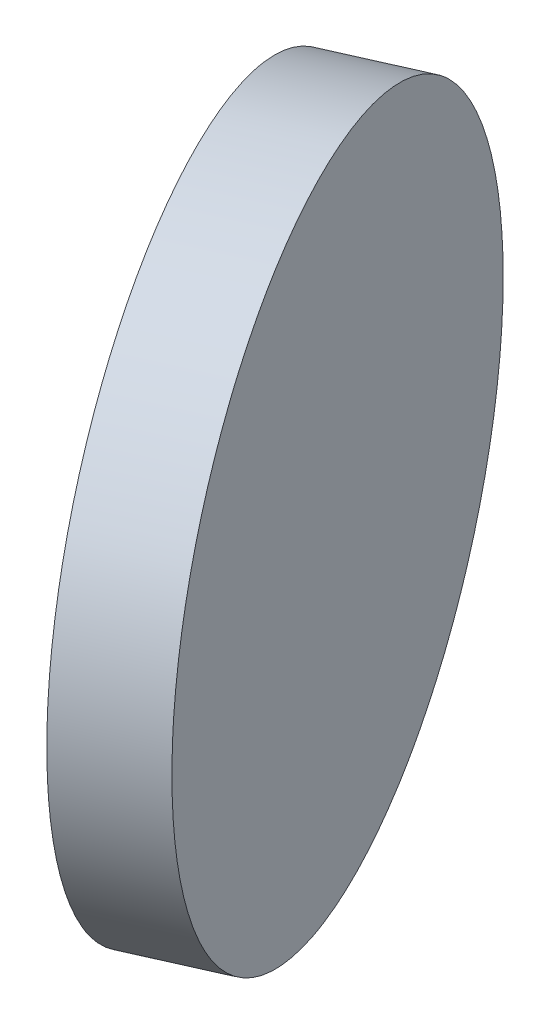
ISO-10303-21;
HEADER;
FILE_DESCRIPTION(('STEP AP214'),'2;1');
FILE_NAME('part.step','',(''),(''),'','','');
FILE_SCHEMA(('AUTOMOTIVE_DESIGN { 1 0 10303 214 1 1 1 1 }'));
ENDSEC;
DATA;
#1=APPLICATION_CONTEXT('core data for automotive mechanical design processes');
#2=APPLICATION_PROTOCOL_DEFINITION('international standard','automotive_design',2000,#1);
#3=PRODUCT_CONTEXT('',#1,'mechanical');
#4=PRODUCT('Part','Part','',(#3));
#5=PRODUCT_RELATED_PRODUCT_CATEGORY('part','',(#4));
#6=PRODUCT_DEFINITION_FORMATION('','',#4);
#7=PRODUCT_DEFINITION_CONTEXT('part definition',#1,'design');
#8=PRODUCT_DEFINITION('design','',#6,#7);
#9=PRODUCT_DEFINITION_SHAPE('','',#8);
#10=(LENGTH_UNIT() NAMED_UNIT(*) SI_UNIT(.MILLI.,.METRE.));
#11=(NAMED_UNIT(*) PLANE_ANGLE_UNIT() SI_UNIT($,.RADIAN.));
#12=(NAMED_UNIT(*) SI_UNIT($,.STERADIAN.) SOLID_ANGLE_UNIT());
#13=UNCERTAINTY_MEASURE_WITH_UNIT(LENGTH_MEASURE(1.E-05),#10,'distance_accuracy_value','');
#14=(GEOMETRIC_REPRESENTATION_CONTEXT(3) GLOBAL_UNCERTAINTY_ASSIGNED_CONTEXT((#13)) GLOBAL_UNIT_ASSIGNED_CONTEXT((#10,
#11,#12)) REPRESENTATION_CONTEXT('',''));
#15=CARTESIAN_POINT('',(0.,0.,0.));
#16=DIRECTION('',(0.,0.,1.));
#17=DIRECTION('',(1.,0.,0.));
#18=AXIS2_PLACEMENT_3D('',#15,#16,#17);
#19=CARTESIAN_POINT('',(143.670458160977,190.866099823164,114.046114975498));
#20=CARTESIAN_POINT('',(143.670458160977,191.240465528177,114.046114975498));
#21=CARTESIAN_POINT('',(143.700452388263,191.989196938203,114.113483112987));
#22=CARTESIAN_POINT('',(143.83369741905,193.069134060952,114.412756352074));
#23=CARTESIAN_POINT('',(144.050075607886,194.064409813418,114.898749721269));
#24=CARTESIAN_POINT('',(144.34127166232,194.936776306592,115.552786767944));
#25=CARTESIAN_POINT('',(144.696095081285,195.652708985369,116.349733215182));
#26=CARTESIAN_POINT('',(145.100910199778,196.184694958404,117.25896285795));
#27=CARTESIAN_POINT('',(145.540160199817,196.512290303094,118.245534510976));
#28=CARTESIAN_POINT('',(145.996964950237,196.622905714061,119.271534778912));
#29=CARTESIAN_POINT('',(146.453769700656,196.512290303094,120.297535046848));
#30=CARTESIAN_POINT('',(146.893019700695,196.184694958404,121.284106699874));
#31=CARTESIAN_POINT('',(147.297834819188,195.652708985369,122.193336342642));
#32=CARTESIAN_POINT('',(147.652658238153,194.936776306592,122.99028278988));
#33=CARTESIAN_POINT('',(147.943854292588,194.064409813418,123.644319836555));
#34=CARTESIAN_POINT('',(148.160232481423,193.069134060952,124.13031320575));
#35=CARTESIAN_POINT('',(148.29347751221,191.989196938203,124.429586444837));
#36=CARTESIAN_POINT('',(148.338468853139,190.866099823164,124.530638651071));
#37=CARTESIAN_POINT('',(148.29347751221,189.743002708125,124.429586444837));
#38=CARTESIAN_POINT('',(148.160232481423,188.663065585376,124.13031320575));
#39=CARTESIAN_POINT('',(147.943854292588,187.66778983291,123.644319836555));
#40=CARTESIAN_POINT('',(147.652658238154,186.795423339736,122.99028278988));
#41=CARTESIAN_POINT('',(147.297834819188,186.079490660959,122.193336342642));
#42=CARTESIAN_POINT('',(146.893019700696,185.547504687924,121.284106699874));
#43=CARTESIAN_POINT('',(146.453769700656,185.219909343234,120.297535046848));
#44=CARTESIAN_POINT('',(145.996964950237,185.109293932267,119.271534778912));
#45=CARTESIAN_POINT('',(145.540160199817,185.219909343234,118.245534510976));
#46=CARTESIAN_POINT('',(145.100910199778,185.547504687924,117.25896285795));
#47=CARTESIAN_POINT('',(144.696095081285,186.079490660959,116.349733215182));
#48=CARTESIAN_POINT('',(144.34127166232,186.795423339736,115.552786767944));
#49=CARTESIAN_POINT('',(144.050075607886,187.66778983291,114.898749721269));
#50=CARTESIAN_POINT('',(143.83369741905,188.663065585376,114.412756352074));
#51=CARTESIAN_POINT('',(143.700452388263,189.743002708125,114.113483112987));
#52=CARTESIAN_POINT('',(143.670458160977,190.491734118151,114.046114975498));
#53=CARTESIAN_POINT('',(143.670458160977,190.866099823164,114.046114975498));
#54=B_SPLINE_CURVE_WITH_KNOTS('',3,(#19,#20,#21,#22,#23,#24,#25,#26,#27,#28,#29,#30,#31,#32,#33,
#34,#35,#36,#37,#38,#39,#40,#41,#42,#43,#44,#45,#46,#47,#48,#49,#50,#51,#52,#53),.UNSPECIFIED.,
.T.,.F.,(4,1,1,1,1,1,1,1,1,1,1,1,1,1,1,1,1,1,1,1,1,1,1,1,1,1,1,1,1,1,1,1,4),(0.,
0.0312499999999998,0.0625000000000001,0.0937499999999999,0.125,0.15625,0.1875,0.21875,0.25,
0.28125,0.3125,0.34375,0.375,0.40625,0.4375,0.46875,0.5,0.53125,0.5625,0.59375,0.625,
0.656249999999999,0.6875,0.71875,0.75,0.78125,0.8125,0.84375,0.875,0.90625,0.9375,0.96875,1.),.UNSPECIFIED.);
#55=DIRECTION('',(0.913545457642608,0.,-0.406736643075785));
#56=VECTOR('',#55,1.);
#57=SURFACE_OF_LINEAR_EXTRUSION('',#54,#56);
#58=CARTESIAN_POINT('',(143.670458160977,190.866099823164,114.046114975498));
#59=CARTESIAN_POINT('',(143.670458162465,190.940973263994,114.046114978838));
#60=CARTESIAN_POINT('',(143.671058050188,191.015846377531,114.047462348725));
#61=CARTESIAN_POINT('',(143.673452976253,191.165477512427,114.052841440739));
#62=CARTESIAN_POINT('',(143.675248022438,191.240235533028,114.05687318048));
#63=CARTESIAN_POINT('',(143.680028651531,191.389521311145,114.067610649226));
#64=CARTESIAN_POINT('',(143.683014238464,191.46404906788,114.074316387269));
#65=CARTESIAN_POINT('',(143.690171349439,191.612759345707,114.090391521713));
#66=CARTESIAN_POINT('',(143.694342869472,191.686941867964,114.09976090911));
#67=CARTESIAN_POINT('',(143.703867256322,191.834846705146,114.121153032225));
#68=CARTESIAN_POINT('',(143.709220115387,191.908569023089,114.133175750531));
#69=CARTESIAN_POINT('',(143.721102557759,192.055438189221,114.15986415306));
#70=CARTESIAN_POINT('',(143.727632141064,192.128585037411,114.174529837284));
#71=CARTESIAN_POINT('',(143.741854345929,192.274192430149,114.206473432416));
#72=CARTESIAN_POINT('',(143.74954697512,192.34665297019,114.223751360466));
#73=CARTESIAN_POINT('',(143.766081627024,192.49077721933,114.260888796686));
#74=CARTESIAN_POINT('',(143.774923653623,192.562440925734,114.280748313583));
#75=CARTESIAN_POINT('',(143.793743460803,192.704860892097,114.323018292588));
#76=CARTESIAN_POINT('',(143.803721237545,192.775617155124,114.345428746072));
#77=CARTESIAN_POINT('',(143.824798921233,192.916111689556,114.392769998744));
#78=CARTESIAN_POINT('',(143.835898820814,192.985849967639,114.417700781391));
#79=CARTESIAN_POINT('',(143.859207069968,193.124197697504,114.470051966126));
#80=CARTESIAN_POINT('',(143.871415419541,193.192807149288,114.497472368214));
#81=CARTESIAN_POINT('',(143.896918351048,193.328795087881,114.554752890223));
#82=CARTESIAN_POINT('',(143.910212940112,193.396173566611,114.584613026152));
#83=CARTESIAN_POINT('',(143.937866197641,193.529597699914,114.646723259481));
#84=CARTESIAN_POINT('',(143.952224869703,193.595643349979,114.678973364958));
#85=CARTESIAN_POINT('',(143.981984138396,193.726299878153,114.745813776807));
#86=CARTESIAN_POINT('',(143.997384731504,193.790910761109,114.780404075267));
#87=CARTESIAN_POINT('',(144.029205708481,193.918595868576,114.851875159739));
#88=CARTESIAN_POINT('',(144.045626085658,193.981670103168,114.888755930719));
#89=CARTESIAN_POINT('',(144.079464418646,194.106179770571,114.964758070979));
#90=CARTESIAN_POINT('',(144.096882374459,194.167615203383,115.00387944026));
#91=CARTESIAN_POINT('',(144.132685969255,194.288757747756,115.084295630811));
#92=CARTESIAN_POINT('',(144.151071614589,194.348464847973,115.125590466342));
#93=CARTESIAN_POINT('',(144.188780778564,194.466061450782,115.210286635343));
#94=CARTESIAN_POINT('',(144.208104300376,194.52395094723,115.253687975934));
#95=CARTESIAN_POINT('',(144.247659398575,194.637822980118,115.342530181084));
#96=CARTESIAN_POINT('',(144.267890971892,194.693805523004,115.387971038749));
#97=CARTESIAN_POINT('',(144.309232379858,194.80377433643,115.480825361325));
#98=CARTESIAN_POINT('',(144.330342208743,194.857760620067,115.528238813292));
#99=CARTESIAN_POINT('',(144.373410237407,194.963647388317,115.624971189451));
#100=CARTESIAN_POINT('',(144.395368437186,195.015547872929,115.674290113643));
#101=CARTESIAN_POINT('',(144.440096783202,195.117189583037,115.774751623631));
#102=CARTESIAN_POINT('',(144.462866934766,195.166930794363,115.825894221391));
#103=CARTESIAN_POINT('',(144.509182863163,195.264180695183,115.929921499788));
#104=CARTESIAN_POINT('',(144.532728642617,195.31168937713,115.982806186314));
#105=CARTESIAN_POINT('',(144.580559490081,195.404400876369,116.090236028644));
#106=CARTESIAN_POINT('',(144.604844555591,195.449603701456,116.144781178836));
#107=CARTESIAN_POINT('',(144.654117667423,195.537630181012,116.255450399975));
#108=CARTESIAN_POINT('',(144.679105709131,195.580453851092,116.311574460559));
#109=CARTESIAN_POINT('',(144.729748353281,195.663648551065,116.425319701648));
#110=CARTESIAN_POINT('',(144.755402955723,195.704019580959,116.482940882153));
#111=CARTESIAN_POINT('',(144.807337167705,195.782254422886,116.599587032089));
#112=CARTESIAN_POINT('',(144.833616781345,195.820118218465,116.658612010728));
#113=CARTESIAN_POINT('',(144.88675957901,195.893284158144,116.777972688552));
#114=CARTESIAN_POINT('',(144.913622765008,195.928586293586,116.838308392167));
#115=CARTESIAN_POINT('',(144.967891249092,195.996574408254,116.960197403085));
#116=CARTESIAN_POINT('',(144.995296545347,196.029260396323,117.021750706271));
#117=CARTESIAN_POINT('',(145.050607822989,196.091961733766,117.145981869868));
#118=CARTESIAN_POINT('',(145.078513801091,196.121977100663,117.208659722896));
#119=CARTESIAN_POINT('',(145.134784892313,196.179282606697,117.33504666309));
#120=CARTESIAN_POINT('',(145.163150005434,196.206572745834,117.398755750255));
#121=CARTESIAN_POINT('',(145.220294280741,196.258394198478,117.527103894012));
#122=CARTESIAN_POINT('',(145.249073445642,196.28292549388,117.591742956702));
#123=CARTESIAN_POINT('',(145.307000864664,196.32919574639,117.721850070042));
#124=CARTESIAN_POINT('',(145.336149120031,196.350934694058,117.787318123493));
#125=CARTESIAN_POINT('',(145.394769733327,196.391586679037,117.918982176665));
#126=CARTESIAN_POINT('',(145.42424209016,196.410499725898,117.985178173925));
#127=CARTESIAN_POINT('',(145.483465952232,196.445466343994,118.118197146032));
#128=CARTESIAN_POINT('',(145.513217455639,196.46151993399,118.185020116762));
#129=CARTESIAN_POINT('',(145.572954527455,196.490734027624,118.319191776827));
#130=CARTESIAN_POINT('',(145.602940095865,196.503894531262,118.386540466161));
#131=CARTESIAN_POINT('',(145.663098412043,196.52731112526,118.521658256553));
#132=CARTESIAN_POINT('',(145.693271161038,196.537567196561,118.589427360366));
#133=CARTESIAN_POINT('',(145.753757083189,196.555163622046,118.725280965821));
#134=CARTESIAN_POINT('',(145.78407025682,196.562503966374,118.793365468529));
#135=CARTESIAN_POINT('',(145.844790242033,196.574257588677,118.929744788229));
#136=CARTESIAN_POINT('',(145.8751970533,196.578670876546,118.998039604511));
#137=CARTESIAN_POINT('',(145.936057559995,196.58455902777,119.134734540628));
#138=CARTESIAN_POINT('',(145.966511255116,196.586033910405,119.20313465977));
#139=CARTESIAN_POINT('',(146.027418645357,196.586033910405,119.339934898054));
#140=CARTESIAN_POINT('',(146.057872340478,196.58455902777,119.408335017196));
#141=CARTESIAN_POINT('',(146.118732847173,196.578670876546,119.545029953313));
#142=CARTESIAN_POINT('',(146.14913965844,196.574257588677,119.613324769595));
#143=CARTESIAN_POINT('',(146.209859643653,196.562503966374,119.749704089295));
#144=CARTESIAN_POINT('',(146.240172817284,196.555163622046,119.817788592002));
#145=CARTESIAN_POINT('',(146.300658739435,196.537567196561,119.953642197458));
#146=CARTESIAN_POINT('',(146.33083148843,196.52731112526,120.021411301271));
#147=CARTESIAN_POINT('',(146.390989804608,196.503894531262,120.156529091663));
#148=CARTESIAN_POINT('',(146.420975373018,196.490734027624,120.223877780997));
#149=CARTESIAN_POINT('',(146.480712444834,196.46151993399,120.358049441062));
#150=CARTESIAN_POINT('',(146.510463948241,196.445466343994,120.424872411792));
#151=CARTESIAN_POINT('',(146.569687810313,196.410499725898,120.557891383899));
#152=CARTESIAN_POINT('',(146.599160167146,196.391586679037,120.624087381159));
#153=CARTESIAN_POINT('',(146.657780780442,196.350934694059,120.755751434331));
#154=CARTESIAN_POINT('',(146.686929035809,196.32919574639,120.821219487782));
#155=CARTESIAN_POINT('',(146.744856454831,196.28292549388,120.951326601122));
#156=CARTESIAN_POINT('',(146.773635619732,196.258394198478,121.015965663812));
#157=CARTESIAN_POINT('',(146.830779895039,196.206572745834,121.144313807569));
#158=CARTESIAN_POINT('',(146.85914500816,196.179282606697,121.208022894734));
#159=CARTESIAN_POINT('',(146.915416099382,196.121977100663,121.334409834928));
#160=CARTESIAN_POINT('',(146.943322077484,196.091961733766,121.397087687956));
#161=CARTESIAN_POINT('',(146.998633355126,196.029260396323,121.521318851552));
#162=CARTESIAN_POINT('',(147.026038651381,195.996574408254,121.582872154739));
#163=CARTESIAN_POINT('',(147.080307135465,195.928586293586,121.704761165657));
#164=CARTESIAN_POINT('',(147.107170321463,195.893284158145,121.765096869272));
#165=CARTESIAN_POINT('',(147.160313119128,195.820118218465,121.884457547096));
#166=CARTESIAN_POINT('',(147.186592732768,195.782254422886,121.943482525735));
#167=CARTESIAN_POINT('',(147.23852694475,195.704019580959,122.060128675671));
#168=CARTESIAN_POINT('',(147.264181547192,195.663648551065,122.117749856176));
#169=CARTESIAN_POINT('',(147.314824191342,195.580453851092,122.231495097265));
#170=CARTESIAN_POINT('',(147.33981223305,195.537630181012,122.287619157849));
#171=CARTESIAN_POINT('',(147.389085344882,195.449603701456,122.398288378988));
#172=CARTESIAN_POINT('',(147.413370410392,195.404400876369,122.452833529179));
#173=CARTESIAN_POINT('',(147.461201257856,195.31168937713,122.56026337151));
#174=CARTESIAN_POINT('',(147.48474703731,195.264180695183,122.613148058036));
#175=CARTESIAN_POINT('',(147.531062965707,195.166930794363,122.717175336433));
#176=CARTESIAN_POINT('',(147.553833117271,195.117189583038,122.768317934193));
#177=CARTESIAN_POINT('',(147.598561463287,195.015547872929,122.868779444181));
#178=CARTESIAN_POINT('',(147.620519663066,194.963647388317,122.918098368373));
#179=CARTESIAN_POINT('',(147.66358769173,194.857760620068,123.014830744532));
#180=CARTESIAN_POINT('',(147.684697520615,194.80377433643,123.062244196499));
#181=CARTESIAN_POINT('',(147.726038928581,194.693805523004,123.155098519075));
#182=CARTESIAN_POINT('',(147.746270501899,194.637822980118,123.20053937674));
#183=CARTESIAN_POINT('',(147.785825600097,194.52395094723,123.28938158189));
#184=CARTESIAN_POINT('',(147.805149121909,194.466061450782,123.332782922481));
#185=CARTESIAN_POINT('',(147.842858285884,194.348464847973,123.417479091482));
#186=CARTESIAN_POINT('',(147.861243931218,194.288757747756,123.458773927013));
#187=CARTESIAN_POINT('',(147.897047526014,194.167615203384,123.539190117564));
#188=CARTESIAN_POINT('',(147.914465481827,194.106179770571,123.578311486844));
#189=CARTESIAN_POINT('',(147.948303814816,193.981670103168,123.654313627105));
#190=CARTESIAN_POINT('',(147.964724191992,193.918595868577,123.691194398085));
#191=CARTESIAN_POINT('',(147.996545168969,193.790910761109,123.762665482556));
#192=CARTESIAN_POINT('',(148.011945762077,193.726299878153,123.797255781017));
#193=CARTESIAN_POINT('',(148.04170503077,193.595643349979,123.864096192865));
#194=CARTESIAN_POINT('',(148.056063702832,193.529597699914,123.896346298343));
#195=CARTESIAN_POINT('',(148.083716960362,193.396173566612,123.958456531672));
#196=CARTESIAN_POINT('',(148.097011549425,193.328795087881,123.988316667601));
#197=CARTESIAN_POINT('',(148.122514480933,193.192807149288,124.04559718961));
#198=CARTESIAN_POINT('',(148.134722830505,193.124197697504,124.073017591698));
#199=CARTESIAN_POINT('',(148.158031079659,192.985849967639,124.125368776433));
#200=CARTESIAN_POINT('',(148.16913097924,192.916111689557,124.15029955908));
#201=CARTESIAN_POINT('',(148.190208662928,192.775617155122,124.197640811751));
#202=CARTESIAN_POINT('',(148.20018643967,192.704860892092,124.220051265236));
#203=CARTESIAN_POINT('',(148.219006246851,192.562440925739,124.262321244241));
#204=CARTESIAN_POINT('',(148.227848273449,192.490777219348,124.282180761138));
#205=CARTESIAN_POINT('',(148.244382925354,192.346652970171,124.319318197358));
#206=CARTESIAN_POINT('',(148.252075554544,192.274192430079,124.336596125409));
#207=CARTESIAN_POINT('',(148.266297759408,192.128585037481,124.368539720539));
#208=CARTESIAN_POINT('',(148.272827342713,192.055438189482,124.383205404759));
#209=CARTESIAN_POINT('',(148.284709785088,191.908569022828,124.409893807298));
#210=CARTESIAN_POINT('',(148.290062644159,191.834846704172,124.421916525617));
#211=CARTESIAN_POINT('',(148.299587030994,191.686941868938,124.443308648697));
#212=CARTESIAN_POINT('',(148.303758551006,191.612759349342,124.452678036047));
#213=CARTESIAN_POINT('',(148.310915662038,191.464049064245,124.468753170619));
#214=CARTESIAN_POINT('',(148.313901249049,191.389521297577,124.475458908838));
#215=CARTESIAN_POINT('',(148.318681877928,191.240235546595,124.486196377104));
#216=CARTESIAN_POINT('',(148.320476923821,191.16547756306,124.49022811619));
#217=CARTESIAN_POINT('',(148.322871850684,191.015846326898,124.495607209994));
#218=CARTESIAN_POINT('',(148.323471739496,190.940973075031,124.496954582326));
#219=CARTESIAN_POINT('',(148.323471739496,190.791226571297,124.496954582326));
#220=CARTESIAN_POINT('',(148.322871850684,190.71635331943,124.495607209994));
#221=CARTESIAN_POINT('',(148.320476923821,190.566722083268,124.49022811619));
#222=CARTESIAN_POINT('',(148.318681877928,190.491964099733,124.486196377104));
#223=CARTESIAN_POINT('',(148.313901249049,190.342678348751,124.475458908838));
#224=CARTESIAN_POINT('',(148.310915662038,190.268150582083,124.468753170619));
#225=CARTESIAN_POINT('',(148.303758551006,190.119440296986,124.452678036047));
#226=CARTESIAN_POINT('',(148.299587030994,190.04525777739,124.443308648697));
#227=CARTESIAN_POINT('',(148.290062644159,189.897352942156,124.421916525617));
#228=CARTESIAN_POINT('',(148.284709785088,189.8236306235,124.409893807298));
#229=CARTESIAN_POINT('',(148.272827342713,189.676761456846,124.383205404759));
#230=CARTESIAN_POINT('',(148.266297759408,189.603614608847,124.368539720539));
#231=CARTESIAN_POINT('',(148.252075554544,189.458007216249,124.336596125409));
#232=CARTESIAN_POINT('',(148.244382925354,189.385546676157,124.319318197358));
#233=CARTESIAN_POINT('',(148.227848273449,189.24142242698,124.282180761137));
#234=CARTESIAN_POINT('',(148.219006246851,189.169758720589,124.262321244241));
#235=CARTESIAN_POINT('',(148.20018643967,189.027338754236,124.220051265236));
#236=CARTESIAN_POINT('',(148.190208662928,188.956582491206,124.197640811751));
#237=CARTESIAN_POINT('',(148.16913097924,188.816087956771,124.15029955908));
#238=CARTESIAN_POINT('',(148.158031079659,188.746349678689,124.125368776433));
#239=CARTESIAN_POINT('',(148.134722830505,188.608001948824,124.073017591698));
#240=CARTESIAN_POINT('',(148.122514480933,188.539392497041,124.04559718961));
#241=CARTESIAN_POINT('',(148.097011549425,188.403404558447,123.988316667601));
#242=CARTESIAN_POINT('',(148.083716960362,188.336026079717,123.958456531672));
#243=CARTESIAN_POINT('',(148.056063702833,188.202601946414,123.896346298343));
#244=CARTESIAN_POINT('',(148.04170503077,188.136556296349,123.864096192865));
#245=CARTESIAN_POINT('',(148.011945762077,188.005899768175,123.797255781017));
#246=CARTESIAN_POINT('',(147.996545168969,187.941288885219,123.762665482556));
#247=CARTESIAN_POINT('',(147.964724191992,187.813603777752,123.691194398085));
#248=CARTESIAN_POINT('',(147.948303814816,187.75052954316,123.654313627105));
#249=CARTESIAN_POINT('',(147.914465481827,187.626019875757,123.578311486845));
#250=CARTESIAN_POINT('',(147.897047526014,187.564584442945,123.539190117564));
#251=CARTESIAN_POINT('',(147.861243931218,187.443441898572,123.458773927013));
#252=CARTESIAN_POINT('',(147.842858285885,187.383734798355,123.417479091482));
#253=CARTESIAN_POINT('',(147.805149121909,187.266138195546,123.332782922481));
#254=CARTESIAN_POINT('',(147.785825600097,187.208248699098,123.28938158189));
#255=CARTESIAN_POINT('',(147.746270501899,187.09437666621,123.20053937674));
#256=CARTESIAN_POINT('',(147.726038928581,187.038394123324,123.155098519075));
#257=CARTESIAN_POINT('',(147.684697520615,186.928425309898,123.062244196499));
#258=CARTESIAN_POINT('',(147.66358769173,186.87443902626,123.014830744532));
#259=CARTESIAN_POINT('',(147.620519663066,186.768552258011,122.918098368373));
#260=CARTESIAN_POINT('',(147.598561463288,186.716651773399,122.868779444181));
#261=CARTESIAN_POINT('',(147.553833117272,186.61501006329,122.768317934193));
#262=CARTESIAN_POINT('',(147.531062965707,186.565268851965,122.717175336433));
#263=CARTESIAN_POINT('',(147.48474703731,186.468018951145,122.613148058036));
#264=CARTESIAN_POINT('',(147.461201257856,186.420510269198,122.56026337151));
#265=CARTESIAN_POINT('',(147.413370410392,186.327798769959,122.45283352918));
#266=CARTESIAN_POINT('',(147.389085344882,186.282595944872,122.398288378988));
#267=CARTESIAN_POINT('',(147.33981223305,186.194569465316,122.287619157849));
#268=CARTESIAN_POINT('',(147.314824191342,186.151745795236,122.231495097265));
#269=CARTESIAN_POINT('',(147.264181547192,186.068551095263,122.117749856176));
#270=CARTESIAN_POINT('',(147.23852694475,186.028180065369,122.060128675671));
#271=CARTESIAN_POINT('',(147.186592732768,185.949945223442,121.943482525735));
#272=CARTESIAN_POINT('',(147.160313119128,185.912081427863,121.884457547096));
#273=CARTESIAN_POINT('',(147.107170321463,185.838915488184,121.765096869272));
#274=CARTESIAN_POINT('',(147.080307135465,185.803613352742,121.704761165657));
#275=CARTESIAN_POINT('',(147.026038651381,185.735625238074,121.582872154739));
#276=CARTESIAN_POINT('',(146.998633355127,185.702939250005,121.521318851553));
#277=CARTESIAN_POINT('',(146.943322077484,185.640237912562,121.397087687956));
#278=CARTESIAN_POINT('',(146.915416099382,185.610222545665,121.334409834928));
#279=CARTESIAN_POINT('',(146.85914500816,185.552917039631,121.208022894734));
#280=CARTESIAN_POINT('',(146.830779895039,185.525626900494,121.144313807569));
#281=CARTESIAN_POINT('',(146.773635619732,185.47380544785,121.015965663812));
#282=CARTESIAN_POINT('',(146.744856454831,185.449274152448,120.951326601122));
#283=CARTESIAN_POINT('',(146.686929035809,185.403003899938,120.821219487782));
#284=CARTESIAN_POINT('',(146.657780780442,185.381264952269,120.755751434331));
#285=CARTESIAN_POINT('',(146.599160167146,185.340612967291,120.624087381159));
#286=CARTESIAN_POINT('',(146.569687810313,185.32169992043,120.557891383899));
#287=CARTESIAN_POINT('',(146.510463948241,185.286733302335,120.424872411792));
#288=CARTESIAN_POINT('',(146.480712444834,185.270679712338,120.358049441062));
#289=CARTESIAN_POINT('',(146.420975373018,185.241465618704,120.223877780997));
#290=CARTESIAN_POINT('',(146.390989804608,185.228305115066,120.156529091663));
#291=CARTESIAN_POINT('',(146.33083148843,185.204888521068,120.021411301271));
#292=CARTESIAN_POINT('',(146.300658739435,185.194632449767,119.953642197458));
#293=CARTESIAN_POINT('',(146.240172817284,185.177036024282,119.817788592003));
#294=CARTESIAN_POINT('',(146.209859643653,185.169695679954,119.749704089295));
#295=CARTESIAN_POINT('',(146.14913965844,185.157942057651,119.613324769595));
#296=CARTESIAN_POINT('',(146.118732847174,185.153528769782,119.545029953313));
#297=CARTESIAN_POINT('',(146.057872340478,185.147640618558,119.408335017196));
#298=CARTESIAN_POINT('',(146.027418645357,185.146165735923,119.339934898054));
#299=CARTESIAN_POINT('',(145.966511255116,185.146165735923,119.20313465977));
#300=CARTESIAN_POINT('',(145.936057559995,185.147640618558,119.134734540628));
#301=CARTESIAN_POINT('',(145.8751970533,185.153528769782,118.998039604511));
#302=CARTESIAN_POINT('',(145.844790242033,185.157942057651,118.929744788229));
#303=CARTESIAN_POINT('',(145.78407025682,185.169695679954,118.793365468529));
#304=CARTESIAN_POINT('',(145.75375708319,185.177036024282,118.725280965821));
#305=CARTESIAN_POINT('',(145.693271161038,185.194632449767,118.589427360366));
#306=CARTESIAN_POINT('',(145.663098412043,185.204888521068,118.521658256553));
#307=CARTESIAN_POINT('',(145.602940095865,185.228305115066,118.386540466161));
#308=CARTESIAN_POINT('',(145.572954527456,185.241465618704,118.319191776827));
#309=CARTESIAN_POINT('',(145.513217455639,185.270679712338,118.185020116762));
#310=CARTESIAN_POINT('',(145.483465952233,185.286733302334,118.118197146032));
#311=CARTESIAN_POINT('',(145.42424209016,185.32169992043,117.985178173925));
#312=CARTESIAN_POINT('',(145.394769733328,185.340612967291,117.918982176665));
#313=CARTESIAN_POINT('',(145.336149120032,185.381264952269,117.787318123493));
#314=CARTESIAN_POINT('',(145.307000864664,185.403003899938,117.721850070042));
#315=CARTESIAN_POINT('',(145.249073445642,185.449274152448,117.591742956702));
#316=CARTESIAN_POINT('',(145.220294280741,185.47380544785,117.527103894012));
#317=CARTESIAN_POINT('',(145.163150005434,185.525626900494,117.398755750255));
#318=CARTESIAN_POINT('',(145.134784892313,185.552917039631,117.33504666309));
#319=CARTESIAN_POINT('',(145.078513801091,185.610222545665,117.208659722896));
#320=CARTESIAN_POINT('',(145.050607822989,185.640237912562,117.145981869868));
#321=CARTESIAN_POINT('',(144.995296545347,185.702939250005,117.021750706271));
#322=CARTESIAN_POINT('',(144.967891249093,185.735625238074,116.960197403085));
#323=CARTESIAN_POINT('',(144.913622765008,185.803613352742,116.838308392167));
#324=CARTESIAN_POINT('',(144.886759579011,185.838915488183,116.777972688552));
#325=CARTESIAN_POINT('',(144.833616781345,185.912081427863,116.658612010728));
#326=CARTESIAN_POINT('',(144.807337167705,185.949945223442,116.599587032089));
#327=CARTESIAN_POINT('',(144.755402955723,186.028180065369,116.482940882153));
#328=CARTESIAN_POINT('',(144.729748353281,186.068551095263,116.425319701648));
#329=CARTESIAN_POINT('',(144.679105709131,186.151745795236,116.311574460559));
#330=CARTESIAN_POINT('',(144.654117667423,186.194569465316,116.255450399975));
#331=CARTESIAN_POINT('',(144.604844555591,186.282595944872,116.144781178836));
#332=CARTESIAN_POINT('',(144.580559490081,186.327798769959,116.090236028644));
#333=CARTESIAN_POINT('',(144.532728642618,186.420510269198,115.982806186314));
#334=CARTESIAN_POINT('',(144.509182863163,186.468018951145,115.929921499788));
#335=CARTESIAN_POINT('',(144.462866934766,186.565268851965,115.825894221391));
#336=CARTESIAN_POINT('',(144.440096783202,186.61501006329,115.774751623631));
#337=CARTESIAN_POINT('',(144.395368437186,186.716651773399,115.674290113643));
#338=CARTESIAN_POINT('',(144.373410237407,186.768552258011,115.624971189451));
#339=CARTESIAN_POINT('',(144.330342208743,186.87443902626,115.528238813292));
#340=CARTESIAN_POINT('',(144.309232379858,186.928425309898,115.480825361325));
#341=CARTESIAN_POINT('',(144.267890971892,187.038394123324,115.387971038749));
#342=CARTESIAN_POINT('',(144.247659398575,187.09437666621,115.342530181084));
#343=CARTESIAN_POINT('',(144.208104300376,187.208248699098,115.253687975934));
#344=CARTESIAN_POINT('',(144.188780778564,187.266138195546,115.210286635343));
#345=CARTESIAN_POINT('',(144.151071614589,187.383734798355,115.125590466342));
#346=CARTESIAN_POINT('',(144.132685969255,187.443441898572,115.084295630811));
#347=CARTESIAN_POINT('',(144.096882374459,187.564584442944,115.00387944026));
#348=CARTESIAN_POINT('',(144.079464418647,187.626019875757,114.964758070979));
#349=CARTESIAN_POINT('',(144.045626085658,187.75052954316,114.888755930719));
#350=CARTESIAN_POINT('',(144.029205708481,187.813603777751,114.851875159739));
#351=CARTESIAN_POINT('',(143.997384731504,187.941288885219,114.780404075267));
#352=CARTESIAN_POINT('',(143.981984138396,188.005899768175,114.745813776807));
#353=CARTESIAN_POINT('',(143.952224869703,188.136556296348,114.678973364958));
#354=CARTESIAN_POINT('',(143.937866197641,188.202601946414,114.646723259481));
#355=CARTESIAN_POINT('',(143.910212940112,188.336026079716,114.584613026152));
#356=CARTESIAN_POINT('',(143.896918351049,188.403404558447,114.554752890223));
#357=CARTESIAN_POINT('',(143.871415419541,188.53939249704,114.497472368214));
#358=CARTESIAN_POINT('',(143.859207069968,188.608001948823,114.470051966126));
#359=CARTESIAN_POINT('',(143.835898820815,188.746349678689,114.417700781391));
#360=CARTESIAN_POINT('',(143.824798921233,188.816087956772,114.392769998744));
#361=CARTESIAN_POINT('',(143.803721237545,188.956582491204,114.345428746072));
#362=CARTESIAN_POINT('',(143.793743460803,189.027338754231,114.323018292588));
#363=CARTESIAN_POINT('',(143.774923653623,189.169758720594,114.280748313583));
#364=CARTESIAN_POINT('',(143.766081627024,189.241422426998,114.260888796686));
#365=CARTESIAN_POINT('',(143.74954697512,189.385546676138,114.223751360466));
#366=CARTESIAN_POINT('',(143.741854345929,189.458007216179,114.206473432416));
#367=CARTESIAN_POINT('',(143.727632141064,189.603614608917,114.174529837284));
#368=CARTESIAN_POINT('',(143.721102557759,189.676761457107,114.15986415306));
#369=CARTESIAN_POINT('',(143.709220115387,189.823630623239,114.133175750531));
#370=CARTESIAN_POINT('',(143.703867256322,189.897352941182,114.121153032225));
#371=CARTESIAN_POINT('',(143.694342869472,190.045257778364,114.09976090911));
#372=CARTESIAN_POINT('',(143.690171349439,190.119440300621,114.090391521713));
#373=CARTESIAN_POINT('',(143.683014238464,190.268150578448,114.074316387269));
#374=CARTESIAN_POINT('',(143.680028651531,190.342678335183,114.067610649226));
#375=CARTESIAN_POINT('',(143.675248022438,190.4919641133,114.05687318048));
#376=CARTESIAN_POINT('',(143.673452976254,190.566722133901,114.052841440739));
#377=CARTESIAN_POINT('',(143.671058050188,190.716353268797,114.047462348725));
#378=CARTESIAN_POINT('',(143.670458162465,190.791226382334,114.046114978838));
#379=CARTESIAN_POINT('',(143.670458160977,190.866099823164,114.046114975498));
#380=B_SPLINE_CURVE_WITH_KNOTS('',3,(#58,#59,#60,#61,#62,#63,#64,#65,#66,#67,#68,#69,#70,#71,
#72,#73,#74,#75,#76,#77,#78,#79,#80,#81,#82,#83,#84,#85,#86,#87,#88,#89,#90,#91,#92,#93,#94,#95,
#96,#97,#98,#99,#100,#101,#102,#103,#104,#105,#106,#107,#108,#109,#110,#111,#112,#113,#114,#115,
#116,#117,#118,#119,#120,#121,#122,#123,#124,#125,#126,#127,#128,#129,#130,#131,#132,#133,#134,
#135,#136,#137,#138,#139,#140,#141,#142,#143,#144,#145,#146,#147,#148,#149,#150,#151,#152,#153,
#154,#155,#156,#157,#158,#159,#160,#161,#162,#163,#164,#165,#166,#167,#168,#169,#170,#171,#172,
#173,#174,#175,#176,#177,#178,#179,#180,#181,#182,#183,#184,#185,#186,#187,#188,#189,#190,#191,
#192,#193,#194,#195,#196,#197,#198,#199,#200,#201,#202,#203,#204,#205,#206,#207,#208,#209,#210,
#211,#212,#213,#214,#215,#216,#217,#218,#219,#220,#221,#222,#223,#224,#225,#226,#227,#228,#229,
#230,#231,#232,#233,#234,#235,#236,#237,#238,#239,#240,#241,#242,#243,#244,#245,#246,#247,#248,
#249,#250,#251,#252,#253,#254,#255,#256,#257,#258,#259,#260,#261,#262,#263,#264,#265,#266,#267,
#268,#269,#270,#271,#272,#273,#274,#275,#276,#277,#278,#279,#280,#281,#282,#283,#284,#285,#286,
#287,#288,#289,#290,#291,#292,#293,#294,#295,#296,#297,#298,#299,#300,#301,#302,#303,#304,#305,
#306,#307,#308,#309,#310,#311,#312,#313,#314,#315,#316,#317,#318,#319,#320,#321,#322,#323,#324,
#325,#326,#327,#328,#329,#330,#331,#332,#333,#334,#335,#336,#337,#338,#339,#340,#341,#342,#343,
#344,#345,#346,#347,#348,#349,#350,#351,#352,#353,#354,#355,#356,#357,#358,#359,#360,#361,#362,
#363,#364,#365,#366,#367,#368,#369,#370,#371,#372,#373,#374,#375,#376,#377,#378,#379),
.UNSPECIFIED.,.F.,.F.,(4,2,2,2,2,2,2,2,2,2,2,2,2,2,2,2,2,2,2,2,2,2,2,2,2,2,2,2,2,2,2,2,2,2,2,2,
2,2,2,2,2,2,2,2,2,2,2,2,2,2,2,2,2,2,2,2,2,2,2,2,2,2,2,2,2,2,2,2,2,2,2,2,2,2,2,2,2,2,2,2,2,2,2,2,
2,2,2,2,2,2,2,2,2,2,2,2,2,2,2,2,2,2,2,2,2,2,2,2,2,2,2,2,2,2,2,2,2,2,2,2,2,2,2,2,2,2,2,2,2,2,2,2,
2,2,2,2,2,2,2,2,2,2,2,2,2,2,2,2,2,2,2,2,2,2,2,2,2,2,2,2,4),(0.,0.224605350375116,
0.449212174577052,0.67381975801935,0.898426582221215,1.1230319325963,1.34763728297138,
1.57224410717334,1.79685169061561,2.02145851481757,2.24606386519263,2.47066921556778,
2.6952760397697,2.91988362321194,3.14449044741391,3.369095797789,3.5937011481641,
3.81830797236604,4.04291555580834,4.26752238001019,4.49212773038531,4.71673308076039,
4.94133990496233,5.1659474884046,5.39055431260655,5.61515966298163,5.83976501335673,
6.06437183755866,6.28897942100095,6.51358624520287,6.73819159557798,6.96279694595309,
7.18740377015499,7.41201135359729,7.6366181777992,7.86122352817432,8.08582887854944,
8.31043570275136,8.53504328619367,8.7596501103956,8.98425546077071,9.20886081114579,
9.43346763534771,9.65807521878997,9.88268204299192,10.107287393367,10.3318927437421,
10.5564995679441,10.7811071513863,11.0057139755883,11.2303193259633,11.4549246763385,
11.6795315005404,11.9041390839826,12.1287459081846,12.3533512585597,12.5779566089348,
12.8025634331367,13.027171016579,13.2517778407809,13.476383191156,13.7009885415311,
13.9255953657331,14.1502029491754,14.3748097733773,14.5994151237524,14.8240204741274,
15.0486272983294,15.2732348817717,15.4978417059736,15.7224470563487,15.9470524067238,
16.1716592309257,16.396266814368,16.62087363857,16.8454789889451,17.0700843393202,
17.2946911635221,17.5192987469644,17.7439055711663,17.9685109215414,18.1931162719165,
18.4177230961184,18.6423306795607,18.8669375037626,19.0915428541377,19.3161482045128,
19.5407550287147,19.765362612157,19.989969436359,20.2145747867341,20.4391801371092,
20.6637869613111,20.8883945447534,21.1130013689553,21.3376067193304,21.5622120697055,
21.7868188939074,22.0114264773497,22.2360333015516,22.4606386519267,22.6852440023018,
22.9098508265037,23.1344584099461,23.3590652341479,23.5836705845231,23.8082759348981,
24.0328827591001,24.2574903425423,24.4820971667443,24.7067025171194,24.9313078674945,
25.1559146916964,25.3805222751387,25.6051290993406,25.8297344497158,26.0543398000909,
26.2789466242928,26.5035542077351,26.728161031937,26.9527663823121,27.1773717326872,
27.4019785568892,27.6265861403314,27.8511929645334,28.0757983149085,28.3004036652836,
28.5250104894855,28.7496180729278,28.9742248971297,29.1988302475048,29.4234355978799,
29.6480424220818,29.8726500055241,30.097256829726,30.3218621801011,30.5464675304762,
30.7710743546782,30.9956819381204,31.2202887623223,31.4448941126974,31.6694994630726,
31.8941062872745,32.1187138707168,32.3433206949187,32.5679260452938,32.7925313956689,
33.0171382198708,33.2417458033131,33.466352627515,33.6909579778901,33.9155633282652,
34.1401701524672,34.3647777359094,34.5893845601113,34.8139899104865,35.0385952608616,
35.2632020850635,35.4878096685058,35.7124164927077,35.9370218430828),.UNSPECIFIED.);
#381=CARTESIAN_POINT('',(143.670458160977,190.866099823164,114.046114975498));
#382=VERTEX_POINT('',#381);
#383=EDGE_CURVE('E9',#382,#382,#380,.T.);
#384=ORIENTED_EDGE('',*,*,#383,.T.);
#385=EDGE_LOOP('',(#384));
#386=FACE_BOUND('',#385,.T.);
#387=CARTESIAN_POINT('',(145.185392190606,190.866099823164,113.371622889157));
#388=CARTESIAN_POINT('',(145.185392215046,190.775343982674,113.37162294405));
#389=CARTESIAN_POINT('',(145.186273582598,190.684588746731,113.373602527983));
#390=CARTESIAN_POINT('',(145.189790839397,190.503283241522,113.381502416096));
#391=CARTESIAN_POINT('',(145.192426742048,190.412732973827,113.387422750383));
#392=CARTESIAN_POINT('',(145.199444906478,190.232042498649,113.403185805778));
#393=CARTESIAN_POINT('',(145.203827169358,190.141902291425,113.41302852936));
#394=CARTESIAN_POINT('',(145.214329620114,189.962236374775,113.436617419974));
#395=CARTESIAN_POINT('',(145.220449795226,189.872710660842,113.450363558337));
#396=CARTESIAN_POINT('',(145.234420880055,189.694479418526,113.481743128635));
#397=CARTESIAN_POINT('',(145.242271786793,189.605773888732,113.499376553877));
#398=CARTESIAN_POINT('',(145.259681447536,189.429381259657,113.538479292128));
#399=CARTESIAN_POINT('',(145.269240214649,189.3416941682,113.559948634577));
#400=CARTESIAN_POINT('',(145.290041006169,189.16753509519,113.606667977257));
#401=CARTESIAN_POINT('',(145.301283033734,189.081063115918,113.631917984581));
#402=CARTESIAN_POINT('',(145.325425798016,188.909530768034,113.686143520982));
#403=CARTESIAN_POINT('',(145.338326523415,188.824470389796,113.715119024639));
#404=CARTESIAN_POINT('',(145.365763830686,188.655959886054,113.776744225746));
#405=CARTESIAN_POINT('',(145.380300407094,188.572509755174,113.809393910925));
#406=CARTESIAN_POINT('',(145.410973058628,188.407405181131,113.878285814223));
#407=CARTESIAN_POINT('',(145.427109145615,188.32575075129,113.914528058983));
#408=CARTESIAN_POINT('',(145.460940660013,188.16441826212,113.990514884438));
#409=CARTESIAN_POINT('',(145.478636092222,188.084740208872,114.030259475909));
#410=CARTESIAN_POINT('',(145.515546698352,187.927541493328,114.113162054625));
#411=CARTESIAN_POINT('',(145.534761862995,187.850020817863,114.156320021029));
#412=CARTESIAN_POINT('',(145.574673904261,187.697320824306,114.245963933434));
#413=CARTESIAN_POINT('',(145.595370773814,187.622141495045,114.292449863555));
#414=CARTESIAN_POINT('',(145.638197731803,187.47429179822,114.388640786113));
#415=CARTESIAN_POINT('',(145.660327830043,187.401621447825,114.438345800571));
#416=CARTESIAN_POINT('',(145.705967129639,187.258947061285,114.540853345799));
#417=CARTESIAN_POINT('',(145.72947633679,187.188943036346,114.593655889584));
#418=CARTESIAN_POINT('',(145.777820767963,187.051760071178,114.702239259812));
#419=CARTESIAN_POINT('',(145.802655985061,186.9845811162,114.758020070702));
#420=CARTESIAN_POINT('',(145.853600458348,186.853210154384,114.872443231132));
#421=CARTESIAN_POINT('',(145.879709706952,186.789018129768,114.931085563636));
#422=CARTESIAN_POINT('',(145.933143090959,186.66376638726,115.051098909069));
#423=CARTESIAN_POINT('',(145.960467233592,186.602706688016,115.112469938239));
#424=CARTESIAN_POINT('',(146.016264572332,186.483847391722,115.237792812934));
#425=CARTESIAN_POINT('',(146.044737774437,186.426047811697,115.301744671934));
#426=CARTESIAN_POINT('',(146.102768675471,186.31383933387,115.432084209679));
#427=CARTESIAN_POINT('',(146.132326369842,186.259430421821,115.498471878188));
#428=CARTESIAN_POINT('',(146.192462259208,186.154136348326,115.633539297136));
#429=CARTESIAN_POINT('',(146.223040447221,186.103251162775,115.702219031891));
#430=CARTESIAN_POINT('',(146.285149129998,186.00512368411,115.841717417387));
#431=CARTESIAN_POINT('',(146.316679629305,185.957881408377,115.912536078331));
#432=CARTESIAN_POINT('',(146.380618107162,185.867133238133,116.056144250864));
#433=CARTESIAN_POINT('',(146.413026091067,185.823627366434,116.128933774483));
#434=CARTESIAN_POINT('',(146.47864592613,185.740449430603,116.276318337134));
#435=CARTESIAN_POINT('',(146.511857774815,185.700777354674,116.35091337061));
#436=CARTESIAN_POINT('',(146.57901185502,185.625365778028,116.501743904267));
#437=CARTESIAN_POINT('',(146.612954081121,185.589626248148,116.577979392278));
#438=CARTESIAN_POINT('',(146.681493477729,185.522169067349,116.73192139752));
#439=CARTESIAN_POINT('',(146.716090650422,185.490451429863,116.809627919662));
#440=CARTESIAN_POINT('',(146.785859141807,185.431094190485,116.966330516973));
#441=CARTESIAN_POINT('',(146.821030464415,185.40345461642,117.045326600936));
#442=CARTESIAN_POINT('',(146.891867341027,185.352313929059,117.204428830756));
#443=CARTESIAN_POINT('',(146.927532894104,185.328812807999,117.284534974529));
#444=CARTESIAN_POINT('',(146.999278240309,185.286009531955,117.445677660462));
#445=CARTESIAN_POINT('',(147.035358030256,185.266707344743,117.526714195476));
#446=CARTESIAN_POINT('',(147.107851205983,185.232358129311,117.689536534017));
#447=CARTESIAN_POINT('',(147.144264592338,185.217311108416,117.771322338832));
#448=CARTESIAN_POINT('',(147.217341309613,185.191489850668,117.935455333149));
#449=CARTESIAN_POINT('',(147.254004642367,185.180715645197,118.017802526769));
#450=CARTESIAN_POINT('',(147.327498059291,185.16346084153,118.18287144382));
#451=CARTESIAN_POINT('',(147.364328143356,185.156980240626,118.265593167015));
#452=CARTESIAN_POINT('',(147.438071811996,185.148332704299,118.431224158623));
#453=CARTESIAN_POINT('',(147.47498539593,185.146165735923,118.514133425597));
#454=CARTESIAN_POINT('',(147.5488125638,185.146165735923,118.679951959546));
#455=CARTESIAN_POINT('',(147.585726147735,185.148332704299,118.76286122652));
#456=CARTESIAN_POINT('',(147.659469816375,185.156980240626,118.928492218127));
#457=CARTESIAN_POINT('',(147.696299900439,185.16346084153,119.011213941322));
#458=CARTESIAN_POINT('',(147.769793317363,185.180715645197,119.176282858374));
#459=CARTESIAN_POINT('',(147.806456650118,185.191489850668,119.258630051994));
#460=CARTESIAN_POINT('',(147.879533367393,185.217311108416,119.42276304631));
#461=CARTESIAN_POINT('',(147.915946753748,185.232358129311,119.504548851126));
#462=CARTESIAN_POINT('',(147.988439929475,185.266707344743,119.667371189666));
#463=CARTESIAN_POINT('',(148.024519719422,185.286009531955,119.748407724681));
#464=CARTESIAN_POINT('',(148.096265065627,185.328812807999,119.909550410614));
#465=CARTESIAN_POINT('',(148.131930618704,185.352313929059,119.989656554387));
#466=CARTESIAN_POINT('',(148.202767495316,185.40345461642,120.148758784206));
#467=CARTESIAN_POINT('',(148.237938817924,185.431094190485,120.22775486817));
#468=CARTESIAN_POINT('',(148.307707309309,185.490451429863,120.384457465481));
#469=CARTESIAN_POINT('',(148.342304482002,185.522169067349,120.462163987623));
#470=CARTESIAN_POINT('',(148.410843878609,185.589626248148,120.616105992864));
#471=CARTESIAN_POINT('',(148.444786104711,185.625365778028,120.692341480876));
#472=CARTESIAN_POINT('',(148.511940184915,185.700777354674,120.843172014533));
#473=CARTESIAN_POINT('',(148.5451520336,185.740449430603,120.917767048009));
#474=CARTESIAN_POINT('',(148.610771868664,185.823627366434,121.065151610659));
#475=CARTESIAN_POINT('',(148.643179852569,185.867133238133,121.137941134278));
#476=CARTESIAN_POINT('',(148.707118330425,185.957881408378,121.281549306811));
#477=CARTESIAN_POINT('',(148.738648829733,186.00512368411,121.352367967755));
#478=CARTESIAN_POINT('',(148.80075751251,186.103251162775,121.491866353251));
#479=CARTESIAN_POINT('',(148.831335700522,186.154136348326,121.560546088006));
#480=CARTESIAN_POINT('',(148.891471589889,186.259430421821,121.695613506955));
#481=CARTESIAN_POINT('',(148.92102928426,186.31383933387,121.762001175464));
#482=CARTESIAN_POINT('',(148.979060185293,186.426047811697,121.892340713209));
#483=CARTESIAN_POINT('',(149.007533387399,186.483847391722,121.956292572209));
#484=CARTESIAN_POINT('',(149.063330726139,186.602706688016,122.081615446904));
#485=CARTESIAN_POINT('',(149.090654868772,186.66376638726,122.142986476073));
#486=CARTESIAN_POINT('',(149.144088252778,186.789018129768,122.262999821506));
#487=CARTESIAN_POINT('',(149.170197501383,186.853210154384,122.321642154011));
#488=CARTESIAN_POINT('',(149.22114197467,186.9845811162,122.436065314441));
#489=CARTESIAN_POINT('',(149.245977191768,187.051760071178,122.491846125331));
#490=CARTESIAN_POINT('',(149.294321622941,187.188943036346,122.600429495558));
#491=CARTESIAN_POINT('',(149.317830830091,187.258947061285,122.653232039344));
#492=CARTESIAN_POINT('',(149.363470129687,187.401621447825,122.755739584572));
#493=CARTESIAN_POINT('',(149.385600227928,187.47429179822,122.80544459903));
#494=CARTESIAN_POINT('',(149.428427185917,187.622141495045,122.901635521588));
#495=CARTESIAN_POINT('',(149.44912405547,187.697320824306,122.948121451709));
#496=CARTESIAN_POINT('',(149.489036096736,187.850020817863,123.037765364113));
#497=CARTESIAN_POINT('',(149.508251261378,187.927541493328,123.080923330517));
#498=CARTESIAN_POINT('',(149.545161867509,188.084740208872,123.163825909233));
#499=CARTESIAN_POINT('',(149.562857299718,188.16441826212,123.203570500705));
#500=CARTESIAN_POINT('',(149.596688814116,188.32575075129,123.27955732616));
#501=CARTESIAN_POINT('',(149.612824901103,188.407405181129,123.315799570919));
#502=CARTESIAN_POINT('',(149.643497552637,188.572509755176,123.384691474218));
#503=CARTESIAN_POINT('',(149.658034129045,188.655959886063,123.417341159398));
#504=CARTESIAN_POINT('',(149.685471436315,188.824470389786,123.478966360502));
#505=CARTESIAN_POINT('',(149.698372161712,188.909530768,123.507941864155));
#506=CARTESIAN_POINT('',(149.722514925999,189.081063115952,123.562167400567));
#507=CARTESIAN_POINT('',(149.733756953571,189.167535095319,123.587417407906));
#508=CARTESIAN_POINT('',(149.754557745072,189.341694168071,123.634136750545));
#509=CARTESIAN_POINT('',(149.764116512161,189.429381259176,123.655606092939));
#510=CARTESIAN_POINT('',(149.781526172972,189.605773889214,123.694708831341));
#511=CARTESIAN_POINT('',(149.789377079802,189.694479420325,123.712342256791));
#512=CARTESIAN_POINT('',(149.803348164379,189.872710659043,123.743721826522));
#513=CARTESIAN_POINT('',(149.809468339146,189.96223636806,123.757467964112));
#514=CARTESIAN_POINT('',(149.819970790843,190.141902298139,123.781056856838));
#515=CARTESIAN_POINT('',(149.824353055008,190.232042523709,123.790899583306));
#516=CARTESIAN_POINT('',(149.831371215928,190.412732948767,123.806662630819));
#517=CARTESIAN_POINT('',(149.834007113785,190.503283147997,123.812582954337));
#518=CARTESIAN_POINT('',(149.837524383681,190.684588840255,123.820482871868));
#519=CARTESIAN_POINT('',(149.838405769124,190.77534433171,123.822462495986));
#520=CARTESIAN_POINT('',(149.838405769124,190.956855314619,123.822462495986));
#521=CARTESIAN_POINT('',(149.837524383681,191.047610806073,123.820482871868));
#522=CARTESIAN_POINT('',(149.834007113785,191.228916498331,123.812582954337));
#523=CARTESIAN_POINT('',(149.831371215928,191.319466697561,123.806662630819));
#524=CARTESIAN_POINT('',(149.824353055008,191.500157122619,123.790899583306));
#525=CARTESIAN_POINT('',(149.819970790843,191.590297348189,123.781056856838));
#526=CARTESIAN_POINT('',(149.809468339146,191.769963278268,123.757467964112));
#527=CARTESIAN_POINT('',(149.803348164379,191.859488987286,123.743721826522));
#528=CARTESIAN_POINT('',(149.789377079802,192.037720226003,123.712342256791));
#529=CARTESIAN_POINT('',(149.781526172971,192.126425757114,123.694708831341));
#530=CARTESIAN_POINT('',(149.764116512161,192.302818387153,123.655606092939));
#531=CARTESIAN_POINT('',(149.754557745072,192.390505478258,123.634136750545));
#532=CARTESIAN_POINT('',(149.73375695357,192.564664551009,123.587417407906));
#533=CARTESIAN_POINT('',(149.722514925999,192.651136530376,123.562167400567));
#534=CARTESIAN_POINT('',(149.698372161712,192.822668878328,123.507941864155));
#535=CARTESIAN_POINT('',(149.685471436315,192.907729256542,123.478966360502));
#536=CARTESIAN_POINT('',(149.658034129045,193.076239760265,123.417341159398));
#537=CARTESIAN_POINT('',(149.643497552637,193.159689891152,123.384691474218));
#538=CARTESIAN_POINT('',(149.612824901103,193.324794465199,123.315799570919));
#539=CARTESIAN_POINT('',(149.596688814116,193.406448895039,123.27955732616));
#540=CARTESIAN_POINT('',(149.562857299718,193.567781384208,123.203570500705));
#541=CARTESIAN_POINT('',(149.545161867509,193.647459437456,123.163825909233));
#542=CARTESIAN_POINT('',(149.508251261378,193.804658153,123.080923330517));
#543=CARTESIAN_POINT('',(149.489036096736,193.882178828465,123.037765364113));
#544=CARTESIAN_POINT('',(149.44912405547,194.034878822022,122.948121451709));
#545=CARTESIAN_POINT('',(149.428427185917,194.110058151283,122.901635521588));
#546=CARTESIAN_POINT('',(149.385600227927,194.257907848108,122.80544459903));
#547=CARTESIAN_POINT('',(149.363470129687,194.330578198503,122.755739584572));
#548=CARTESIAN_POINT('',(149.317830830091,194.473252585043,122.653232039343));
#549=CARTESIAN_POINT('',(149.294321622941,194.543256609982,122.600429495558));
#550=CARTESIAN_POINT('',(149.245977191768,194.68043957515,122.491846125331));
#551=CARTESIAN_POINT('',(149.22114197467,194.747618530128,122.436065314441));
#552=CARTESIAN_POINT('',(149.170197501383,194.878989491944,122.321642154011));
#553=CARTESIAN_POINT('',(149.144088252778,194.94318151656,122.262999821506));
#554=CARTESIAN_POINT('',(149.090654868772,195.068433259068,122.142986476073));
#555=CARTESIAN_POINT('',(149.063330726139,195.129492958313,122.081615446904));
#556=CARTESIAN_POINT('',(149.007533387399,195.248352254606,121.956292572209));
#557=CARTESIAN_POINT('',(148.979060185293,195.306151834631,121.892340713209));
#558=CARTESIAN_POINT('',(148.921029284259,195.418360312458,121.762001175464));
#559=CARTESIAN_POINT('',(148.891471589889,195.472769224507,121.695613506955));
#560=CARTESIAN_POINT('',(148.831335700522,195.578063298002,121.560546088006));
#561=CARTESIAN_POINT('',(148.80075751251,195.628948483553,121.491866353251));
#562=CARTESIAN_POINT('',(148.738648829733,195.727075962218,121.352367967755));
#563=CARTESIAN_POINT('',(148.707118330425,195.774318237951,121.281549306811));
#564=CARTESIAN_POINT('',(148.643179852569,195.865066408195,121.137941134278));
#565=CARTESIAN_POINT('',(148.610771868664,195.908572279894,121.065151610659));
#566=CARTESIAN_POINT('',(148.5451520336,195.991750215725,120.917767048009));
#567=CARTESIAN_POINT('',(148.511940184915,196.031422291654,120.843172014533));
#568=CARTESIAN_POINT('',(148.44478610471,196.1068338683,120.692341480876));
#569=CARTESIAN_POINT('',(148.410843878609,196.14257339818,120.616105992864));
#570=CARTESIAN_POINT('',(148.342304482002,196.210030578979,120.462163987623));
#571=CARTESIAN_POINT('',(148.307707309309,196.241748216465,120.384457465481));
#572=CARTESIAN_POINT('',(148.237938817924,196.301105455843,120.22775486817));
#573=CARTESIAN_POINT('',(148.202767495316,196.328745029908,120.148758784206));
#574=CARTESIAN_POINT('',(148.131930618704,196.379885717269,119.989656554387));
#575=CARTESIAN_POINT('',(148.096265065627,196.403386838329,119.909550410614));
#576=CARTESIAN_POINT('',(148.024519719421,196.446190114373,119.748407724681));
#577=CARTESIAN_POINT('',(147.988439929475,196.465492301585,119.667371189666));
#578=CARTESIAN_POINT('',(147.915946753748,196.499841517017,119.504548851126));
#579=CARTESIAN_POINT('',(147.879533367393,196.514888537912,119.42276304631));
#580=CARTESIAN_POINT('',(147.806456650118,196.54070979566,119.258630051994));
#581=CARTESIAN_POINT('',(147.769793317363,196.551484001131,119.176282858374));
#582=CARTESIAN_POINT('',(147.696299900439,196.568738804798,119.011213941322));
#583=CARTESIAN_POINT('',(147.659469816375,196.575219405702,118.928492218127));
#584=CARTESIAN_POINT('',(147.585726147735,196.583866942029,118.76286122652));
#585=CARTESIAN_POINT('',(147.5488125638,196.586033910405,118.679951959546));
#586=CARTESIAN_POINT('',(147.47498539593,196.586033910405,118.514133425597));
#587=CARTESIAN_POINT('',(147.438071811995,196.583866942029,118.431224158623));
#588=CARTESIAN_POINT('',(147.364328143356,196.575219405702,118.265593167015));
#589=CARTESIAN_POINT('',(147.327498059291,196.568738804798,118.18287144382));
#590=CARTESIAN_POINT('',(147.254004642367,196.551484001131,118.017802526769));
#591=CARTESIAN_POINT('',(147.217341309613,196.54070979566,117.935455333149));
#592=CARTESIAN_POINT('',(147.144264592337,196.514888537912,117.771322338832));
#593=CARTESIAN_POINT('',(147.107851205983,196.499841517017,117.689536534017));
#594=CARTESIAN_POINT('',(147.035358030255,196.465492301585,117.526714195476));
#595=CARTESIAN_POINT('',(146.999278240309,196.446190114373,117.445677660462));
#596=CARTESIAN_POINT('',(146.927532894104,196.403386838329,117.284534974529));
#597=CARTESIAN_POINT('',(146.891867341027,196.379885717269,117.204428830756));
#598=CARTESIAN_POINT('',(146.821030464414,196.328745029908,117.045326600936));
#599=CARTESIAN_POINT('',(146.785859141807,196.301105455843,116.966330516973));
#600=CARTESIAN_POINT('',(146.716090650422,196.241748216465,116.809627919662));
#601=CARTESIAN_POINT('',(146.681493477728,196.210030578979,116.73192139752));
#602=CARTESIAN_POINT('',(146.612954081121,196.14257339818,116.577979392278));
#603=CARTESIAN_POINT('',(146.57901185502,196.1068338683,116.501743904267));
#604=CARTESIAN_POINT('',(146.511857774815,196.031422291654,116.35091337061));
#605=CARTESIAN_POINT('',(146.47864592613,195.991750215725,116.276318337134));
#606=CARTESIAN_POINT('',(146.413026091067,195.908572279894,116.128933774483));
#607=CARTESIAN_POINT('',(146.380618107162,195.865066408195,116.056144250864));
#608=CARTESIAN_POINT('',(146.316679629305,195.77431823795,115.912536078331));
#609=CARTESIAN_POINT('',(146.285149129998,195.727075962218,115.841717417387));
#610=CARTESIAN_POINT('',(146.223040447221,195.628948483553,115.702219031891));
#611=CARTESIAN_POINT('',(146.192462259208,195.578063298002,115.633539297136));
#612=CARTESIAN_POINT('',(146.132326369842,195.472769224507,115.498471878188));
#613=CARTESIAN_POINT('',(146.102768675471,195.418360312458,115.432084209679));
#614=CARTESIAN_POINT('',(146.044737774437,195.306151834631,115.301744671934));
#615=CARTESIAN_POINT('',(146.016264572331,195.248352254606,115.237792812934));
#616=CARTESIAN_POINT('',(145.960467233592,195.129492958312,115.112469938239));
#617=CARTESIAN_POINT('',(145.933143090959,195.068433259068,115.051098909069));
#618=CARTESIAN_POINT('',(145.879709706952,194.94318151656,114.931085563636));
#619=CARTESIAN_POINT('',(145.853600458348,194.878989491944,114.872443231132));
#620=CARTESIAN_POINT('',(145.802655985061,194.747618530128,114.758020070702));
#621=CARTESIAN_POINT('',(145.777820767963,194.68043957515,114.702239259812));
#622=CARTESIAN_POINT('',(145.72947633679,194.543256609982,114.593655889584));
#623=CARTESIAN_POINT('',(145.705967129639,194.473252585043,114.540853345799));
#624=CARTESIAN_POINT('',(145.660327830043,194.330578198503,114.438345800571));
#625=CARTESIAN_POINT('',(145.638197731803,194.257907848108,114.388640786113));
#626=CARTESIAN_POINT('',(145.595370773814,194.110058151283,114.292449863555));
#627=CARTESIAN_POINT('',(145.574673904261,194.034878822022,114.245963933434));
#628=CARTESIAN_POINT('',(145.534761862995,193.882178828465,114.156320021029));
#629=CARTESIAN_POINT('',(145.515546698352,193.804658153,114.113162054625));
#630=CARTESIAN_POINT('',(145.478636092222,193.647459437456,114.030259475909));
#631=CARTESIAN_POINT('',(145.460940660013,193.567781384208,113.990514884438));
#632=CARTESIAN_POINT('',(145.427109145615,193.406448895038,113.914528058983));
#633=CARTESIAN_POINT('',(145.410973058628,193.324794465197,113.878285814223));
#634=CARTESIAN_POINT('',(145.380300407094,193.159689891154,113.809393910925));
#635=CARTESIAN_POINT('',(145.365763830686,193.076239760274,113.776744225746));
#636=CARTESIAN_POINT('',(145.338326523415,192.907729256532,113.715119024639));
#637=CARTESIAN_POINT('',(145.325425798016,192.822668878294,113.686143520982));
#638=CARTESIAN_POINT('',(145.301283033734,192.65113653041,113.631917984581));
#639=CARTESIAN_POINT('',(145.290041006169,192.564664551138,113.606667977257));
#640=CARTESIAN_POINT('',(145.269240214649,192.390505478128,113.559948634577));
#641=CARTESIAN_POINT('',(145.259681447536,192.30281838667,113.538479292128));
#642=CARTESIAN_POINT('',(145.242271786793,192.126425757596,113.499376553877));
#643=CARTESIAN_POINT('',(145.234420880054,192.037720227802,113.481743128635));
#644=CARTESIAN_POINT('',(145.220449795226,191.859488985486,113.450363558337));
#645=CARTESIAN_POINT('',(145.214329620114,191.769963271553,113.436617419974));
#646=CARTESIAN_POINT('',(145.203827169358,191.590297354903,113.41302852936));
#647=CARTESIAN_POINT('',(145.199444906478,191.500157147679,113.403185805778));
#648=CARTESIAN_POINT('',(145.192426742048,191.319466672501,113.387422750383));
#649=CARTESIAN_POINT('',(145.189790839397,191.228916404806,113.381502416096));
#650=CARTESIAN_POINT('',(145.186273582598,191.047610899597,113.373602527983));
#651=CARTESIAN_POINT('',(145.185392215046,190.956855663654,113.37162294405));
#652=CARTESIAN_POINT('',(145.185392190606,190.866099823164,113.371622889157));
#653=B_SPLINE_CURVE_WITH_KNOTS('',3,(#387,#388,#389,#390,#391,#392,#393,#394,#395,#396,#397,
#398,#399,#400,#401,#402,#403,#404,#405,#406,#407,#408,#409,#410,#411,#412,#413,#414,#415,#416,
#417,#418,#419,#420,#421,#422,#423,#424,#425,#426,#427,#428,#429,#430,#431,#432,#433,#434,#435,
#436,#437,#438,#439,#440,#441,#442,#443,#444,#445,#446,#447,#448,#449,#450,#451,#452,#453,#454,
#455,#456,#457,#458,#459,#460,#461,#462,#463,#464,#465,#466,#467,#468,#469,#470,#471,#472,#473,
#474,#475,#476,#477,#478,#479,#480,#481,#482,#483,#484,#485,#486,#487,#488,#489,#490,#491,#492,
#493,#494,#495,#496,#497,#498,#499,#500,#501,#502,#503,#504,#505,#506,#507,#508,#509,#510,#511,
#512,#513,#514,#515,#516,#517,#518,#519,#520,#521,#522,#523,#524,#525,#526,#527,#528,#529,#530,
#531,#532,#533,#534,#535,#536,#537,#538,#539,#540,#541,#542,#543,#544,#545,#546,#547,#548,#549,
#550,#551,#552,#553,#554,#555,#556,#557,#558,#559,#560,#561,#562,#563,#564,#565,#566,#567,#568,
#569,#570,#571,#572,#573,#574,#575,#576,#577,#578,#579,#580,#581,#582,#583,#584,#585,#586,#587,
#588,#589,#590,#591,#592,#593,#594,#595,#596,#597,#598,#599,#600,#601,#602,#603,#604,#605,#606,
#607,#608,#609,#610,#611,#612,#613,#614,#615,#616,#617,#618,#619,#620,#621,#622,#623,#624,#625,
#626,#627,#628,#629,#630,#631,#632,#633,#634,#635,#636,#637,#638,#639,#640,#641,#642,#643,#644,
#645,#646,#647,#648,#649,#650,#651,#652),.UNSPECIFIED.,.F.,.F.,(4,2,2,2,2,2,2,2,2,2,2,2,2,2,2,2,
2,2,2,2,2,2,2,2,2,2,2,2,2,2,2,2,2,2,2,2,2,2,2,2,2,2,2,2,2,2,2,2,2,2,2,2,2,2,2,2,2,2,2,2,2,2,2,2,
2,2,2,2,2,2,2,2,2,2,2,2,2,2,2,2,2,2,2,2,2,2,2,2,2,2,2,2,2,2,2,2,2,2,2,2,2,2,2,2,2,2,2,2,2,2,2,2,
2,2,2,2,2,2,2,2,2,2,2,2,2,2,2,2,2,2,2,2,4),(0.,0.272240869082034,0.544483817952321,
0.816726938463777,1.08896805953156,1.36120871196949,1.63345145399144,1.90569470682855,
2.17793610219305,2.45017658832669,2.72241909342876,2.99466243619478,3.26690411686861,
3.53914449859534,3.81138674286835,4.08363013111242,4.35587209783711,4.62811244399065,
4.90035441071531,5.17259779895934,5.44484004323238,5.71708042495912,5.98932210563293,
6.26156544839895,6.533807953501,6.80604843963471,7.07828983499916,7.35053308783625,
7.62277582985827,7.89501648229619,8.16725760336393,8.43950072387536,8.71174367274563,
8.98398454182765,9.2562254109097,9.52846835977997,9.80071148029143,10.0729526013592,
10.3451932537971,10.6174359958191,10.8896792486563,11.1619206440207,11.4341611301544,
11.7064036352565,11.9786469780225,12.2508886586963,12.523129040423,12.795371284696,
13.0676146729401,13.3398566396647,13.6120969858183,13.884338952543,14.156582340787,
14.4288245850601,14.7010649667868,14.9733066474606,15.2455499902266,15.5177924953286,
15.7900329814623,16.0622743768268,16.3345176296639,16.606760371686,16.8790010241239,
17.1512421451916,17.423485265703,17.6957282145733,17.9679690836553,18.2402099527374,
18.5124529016077,18.7846960221191,19.0569371431869,19.3291777956248,19.6014205376468,
19.8736637904839,20.1459051858483,20.418145671982,20.6903881770841,20.9626315198501,
21.2348732005239,21.5071135822506,21.7793558265237,22.0515992147677,22.3238411814924,
22.596081527646,22.8683234943706,23.1405668826147,23.4128091268877,23.6850495086144,
23.9572911892882,24.2295345320543,24.5017770371563,24.77401752329,25.0462589186545,
25.3185021714916,25.5907449135136,25.8629855659515,26.1352266870192,26.4074698075307,
26.679712756401,26.951953625483,27.224194494565,27.4964374434353,27.7686805639468,
28.0409216850145,28.3131623374525,28.5854050794744,28.8576483323116,29.129889727676,
29.4021302138097,29.6743727189118,29.9466160616778,30.2188577423516,30.4910981240783,
30.7633403683513,31.0355837565954,31.3078257233201,31.5800660694736,31.8523080361983,
32.1245514244424,32.3967936687154,32.6690340504421,32.9412757311159,33.2135190738819,
33.485761578984,33.7580020651177,34.0302434604821,34.3024867133192,34.5747294553413,
34.8469701077792,35.1192112288469,35.3914543493584,35.6636972982286,35.9359381673107),.UNSPECIFIED.);
#654=CARTESIAN_POINT('',(145.185392190606,190.866099823164,113.371622889157));
#655=VERTEX_POINT('',#654);
#656=EDGE_CURVE('E24',#655,#655,#653,.F.);
#657=ORIENTED_EDGE('',*,*,#656,.F.);
#658=EDGE_LOOP('',(#657));
#659=FACE_BOUND('',#658,.T.);
#660=ADVANCED_FACE('F14',(#386,#659),#57,.T.);
#661=CARTESIAN_POINT('',(148.25947820101,190.866099823164,124.353222741595));
#662=DIRECTION('',(0.913545457642608,0.,-0.406736643075785));
#663=DIRECTION('',(0.,1.,0.));
#664=AXIS2_PLACEMENT_3D('',#661,#662,#663);
#665=PLANE('',#664);
#666=ORIENTED_EDGE('',*,*,#383,.F.);
#667=EDGE_LOOP('',(#666));
#668=FACE_BOUND('',#667,.T.);
#669=ADVANCED_FACE('F62',(#668),#665,.F.);
#670=CARTESIAN_POINT('',(149.774412230639,190.866099823164,123.678730655254));
#671=DIRECTION('',(0.913545457642608,0.,-0.406736643075785));
#672=DIRECTION('',(0.,1.,0.));
#673=AXIS2_PLACEMENT_3D('',#670,#671,#672);
#674=PLANE('',#673);
#675=ORIENTED_EDGE('',*,*,#656,.T.);
#676=EDGE_LOOP('',(#675));
#677=FACE_BOUND('',#676,.T.);
#678=ADVANCED_FACE('F31',(#677),#674,.T.);
#679=CLOSED_SHELL('',(#660,#669,#678));
#680=MANIFOLD_SOLID_BREP('B1',#679);
#681=ADVANCED_BREP_SHAPE_REPRESENTATION('',(#18,#680),#14);
#682=SHAPE_DEFINITION_REPRESENTATION(#9,#681);
ENDSEC;
END-ISO-10303-21;
